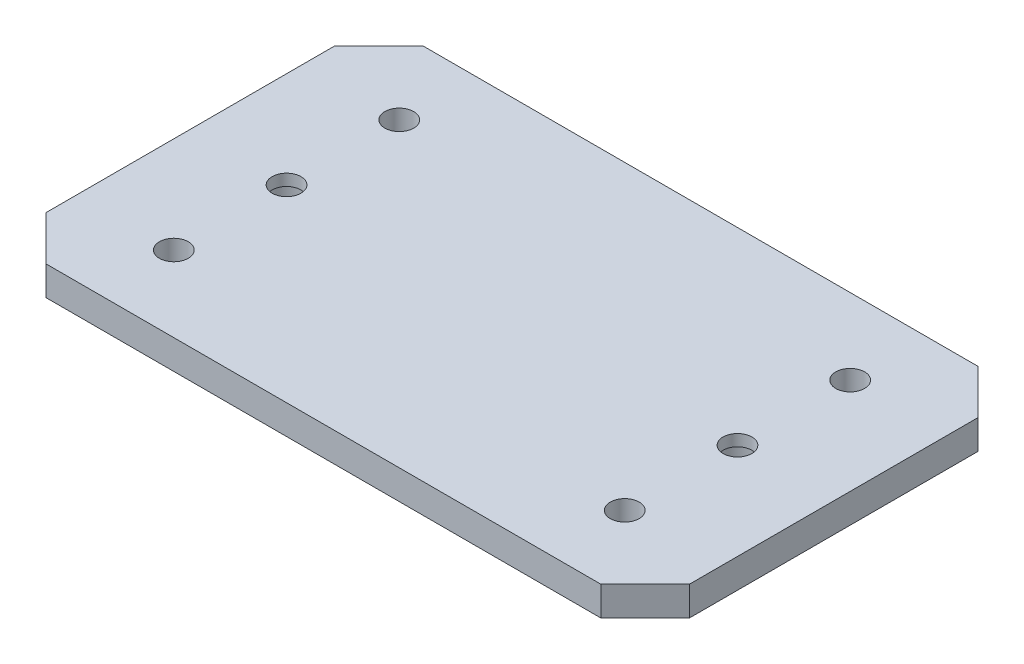
ISO-10303-21;
HEADER;
FILE_DESCRIPTION(('STEP AP214'),'2;1');
FILE_NAME('part.step','',(''),(''),'','','');
FILE_SCHEMA(('AUTOMOTIVE_DESIGN { 1 0 10303 214 1 1 1 1 }'));
ENDSEC;
DATA;
#1=APPLICATION_CONTEXT('core data for automotive mechanical design processes');
#2=APPLICATION_PROTOCOL_DEFINITION('international standard','automotive_design',2000,#1);
#3=PRODUCT_CONTEXT('',#1,'mechanical');
#4=PRODUCT('Part','Part','',(#3));
#5=PRODUCT_RELATED_PRODUCT_CATEGORY('part','',(#4));
#6=PRODUCT_DEFINITION_FORMATION('','',#4);
#7=PRODUCT_DEFINITION_CONTEXT('part definition',#1,'design');
#8=PRODUCT_DEFINITION('design','',#6,#7);
#9=PRODUCT_DEFINITION_SHAPE('','',#8);
#10=(LENGTH_UNIT() NAMED_UNIT(*) SI_UNIT(.MILLI.,.METRE.));
#11=(NAMED_UNIT(*) PLANE_ANGLE_UNIT() SI_UNIT($,.RADIAN.));
#12=(NAMED_UNIT(*) SI_UNIT($,.STERADIAN.) SOLID_ANGLE_UNIT());
#13=UNCERTAINTY_MEASURE_WITH_UNIT(LENGTH_MEASURE(1.E-05),#10,'distance_accuracy_value','');
#14=(GEOMETRIC_REPRESENTATION_CONTEXT(3) GLOBAL_UNCERTAINTY_ASSIGNED_CONTEXT((#13)) GLOBAL_UNIT_ASSIGNED_CONTEXT((#10,
#11,#12)) REPRESENTATION_CONTEXT('',''));
#15=CARTESIAN_POINT('',(0.,0.,0.));
#16=DIRECTION('',(0.,0.,1.));
#17=DIRECTION('',(1.,0.,0.));
#18=AXIS2_PLACEMENT_3D('',#15,#16,#17);
#19=CARTESIAN_POINT('',(-50.8,0.,0.));
#20=DIRECTION('',(0.,1.,0.));
#21=DIRECTION('',(0.,0.,1.));
#22=AXIS2_PLACEMENT_3D('',#19,#20,#21);
#23=CYLINDRICAL_SURFACE('',#22,3.25);
#24=CARTESIAN_POINT('',(-50.8,6.6,0.));
#25=DIRECTION('',(0.,1.,0.));
#26=DIRECTION('',(0.,0.,-1.));
#27=AXIS2_PLACEMENT_3D('',#24,#25,#26);
#28=CIRCLE('',#27,3.25);
#29=CARTESIAN_POINT('',(-50.8,6.6,-3.24999999999997));
#30=VERTEX_POINT('',#29);
#31=EDGE_CURVE('E189',#30,#30,#28,.T.);
#32=ORIENTED_EDGE('',*,*,#31,.T.);
#33=EDGE_LOOP('',(#32));
#34=FACE_BOUND('',#33,.T.);
#35=CARTESIAN_POINT('',(-50.8,4.,0.));
#36=DIRECTION('',(0.,-1.,0.));
#37=DIRECTION('',(0.,0.,-1.));
#38=AXIS2_PLACEMENT_3D('',#35,#36,#37);
#39=CIRCLE('',#38,3.25);
#40=CARTESIAN_POINT('',(-50.8,4.,-3.24999999999997));
#41=VERTEX_POINT('',#40);
#42=EDGE_CURVE('E212',#41,#41,#39,.F.);
#43=ORIENTED_EDGE('',*,*,#42,.F.);
#44=EDGE_LOOP('',(#43));
#45=FACE_BOUND('',#44,.T.);
#46=ADVANCED_FACE('F36',(#34,#45),#23,.F.);
#47=CARTESIAN_POINT('',(50.8,0.,0.));
#48=DIRECTION('',(0.,1.,0.));
#49=DIRECTION('',(0.,0.,1.));
#50=AXIS2_PLACEMENT_3D('',#47,#48,#49);
#51=CYLINDRICAL_SURFACE('',#50,3.25);
#52=CARTESIAN_POINT('',(50.8,6.6,0.));
#53=DIRECTION('',(0.,1.,0.));
#54=DIRECTION('',(0.,0.,1.));
#55=AXIS2_PLACEMENT_3D('',#52,#53,#54);
#56=CIRCLE('',#55,3.25);
#57=CARTESIAN_POINT('',(50.8,6.6,3.25));
#58=VERTEX_POINT('',#57);
#59=EDGE_CURVE('E182',#58,#58,#56,.T.);
#60=ORIENTED_EDGE('',*,*,#59,.T.);
#61=EDGE_LOOP('',(#60));
#62=FACE_BOUND('',#61,.T.);
#63=CARTESIAN_POINT('',(50.8,4.,0.));
#64=DIRECTION('',(0.,-1.,0.));
#65=DIRECTION('',(0.,0.,-1.));
#66=AXIS2_PLACEMENT_3D('',#63,#64,#65);
#67=CIRCLE('',#66,3.25);
#68=CARTESIAN_POINT('',(50.8,4.,-3.25));
#69=VERTEX_POINT('',#68);
#70=EDGE_CURVE('E222',#69,#69,#67,.F.);
#71=ORIENTED_EDGE('',*,*,#70,.F.);
#72=EDGE_LOOP('',(#71));
#73=FACE_BOUND('',#72,.T.);
#74=ADVANCED_FACE('F333',(#62,#73),#51,.F.);
#75=CARTESIAN_POINT('',(72.5,6.6,42.5));
#76=DIRECTION('',(-1.,0.,0.));
#77=DIRECTION('',(0.,0.,1.));
#78=AXIS2_PLACEMENT_3D('',#75,#76,#77);
#79=PLANE('',#78);
#80=DIRECTION('',(0.,0.,-1.));
#81=VECTOR('',#80,1.);
#82=CARTESIAN_POINT('',(72.5,0.,42.5));
#83=LINE('',#82,#81);
#84=CARTESIAN_POINT('',(72.5,0.,32.5));
#85=VERTEX_POINT('',#84);
#86=CARTESIAN_POINT('',(72.5,0.,-32.5));
#87=VERTEX_POINT('',#86);
#88=EDGE_CURVE('E129',#85,#87,#83,.T.);
#89=ORIENTED_EDGE('',*,*,#88,.T.);
#90=DIRECTION('',(0.,1.,0.));
#91=VECTOR('',#90,1.);
#92=CARTESIAN_POINT('',(72.5,6.6,-32.5));
#93=LINE('',#92,#91);
#94=CARTESIAN_POINT('',(72.5,6.6,-32.5));
#95=VERTEX_POINT('',#94);
#96=EDGE_CURVE('E107',#87,#95,#93,.T.);
#97=ORIENTED_EDGE('',*,*,#96,.T.);
#98=DIRECTION('',(0.,0.,-1.));
#99=VECTOR('',#98,1.);
#100=CARTESIAN_POINT('',(72.5,6.6,42.5));
#101=LINE('',#100,#99);
#102=CARTESIAN_POINT('',(72.5,6.6,32.5));
#103=VERTEX_POINT('',#102);
#104=EDGE_CURVE('E139',#103,#95,#101,.T.);
#105=ORIENTED_EDGE('',*,*,#104,.F.);
#106=DIRECTION('',(0.,-1.,0.));
#107=VECTOR('',#106,1.);
#108=CARTESIAN_POINT('',(72.5,6.6,32.5));
#109=LINE('',#108,#107);
#110=EDGE_CURVE('E112',#103,#85,#109,.T.);
#111=ORIENTED_EDGE('',*,*,#110,.T.);
#112=EDGE_LOOP('',(#89,#97,#105,#111));
#113=FACE_BOUND('',#112,.T.);
#114=ADVANCED_FACE('F321',(#113),#79,.F.);
#115=CARTESIAN_POINT('',(-72.5,6.6,-42.5));
#116=DIRECTION('',(0.,0.,1.));
#117=DIRECTION('',(1.,0.,0.));
#118=AXIS2_PLACEMENT_3D('',#115,#116,#117);
#119=PLANE('',#118);
#120=DIRECTION('',(-1.,0.,0.));
#121=VECTOR('',#120,1.);
#122=CARTESIAN_POINT('',(-72.5,6.6,-42.5));
#123=LINE('',#122,#121);
#124=CARTESIAN_POINT('',(62.5,6.6,-42.5));
#125=VERTEX_POINT('',#124);
#126=CARTESIAN_POINT('',(-62.5,6.6,-42.5));
#127=VERTEX_POINT('',#126);
#128=EDGE_CURVE('E122',#125,#127,#123,.T.);
#129=ORIENTED_EDGE('',*,*,#128,.F.);
#130=DIRECTION('',(0.,-1.,0.));
#131=VECTOR('',#130,1.);
#132=CARTESIAN_POINT('',(62.5,6.6,-42.5));
#133=LINE('',#132,#131);
#134=CARTESIAN_POINT('',(62.5,0.,-42.5));
#135=VERTEX_POINT('',#134);
#136=EDGE_CURVE('E106',#125,#135,#133,.T.);
#137=ORIENTED_EDGE('',*,*,#136,.T.);
#138=DIRECTION('',(-1.,0.,0.));
#139=VECTOR('',#138,1.);
#140=CARTESIAN_POINT('',(-72.5,0.,-42.5));
#141=LINE('',#140,#139);
#142=CARTESIAN_POINT('',(-62.5,0.,-42.5));
#143=VERTEX_POINT('',#142);
#144=EDGE_CURVE('E119',#135,#143,#141,.T.);
#145=ORIENTED_EDGE('',*,*,#144,.T.);
#146=DIRECTION('',(0.,1.,0.));
#147=VECTOR('',#146,1.);
#148=CARTESIAN_POINT('',(-62.5,6.6,-42.5));
#149=LINE('',#148,#147);
#150=EDGE_CURVE('E124',#143,#127,#149,.T.);
#151=ORIENTED_EDGE('',*,*,#150,.T.);
#152=EDGE_LOOP('',(#129,#137,#145,#151));
#153=FACE_BOUND('',#152,.T.);
#154=ADVANCED_FACE('F118',(#153),#119,.F.);
#155=CARTESIAN_POINT('',(-72.5,6.6,42.5));
#156=DIRECTION('',(1.,0.,0.));
#157=DIRECTION('',(0.,0.,-1.));
#158=AXIS2_PLACEMENT_3D('',#155,#156,#157);
#159=PLANE('',#158);
#160=DIRECTION('',(0.,0.,1.));
#161=VECTOR('',#160,1.);
#162=CARTESIAN_POINT('',(-72.5,0.,42.5));
#163=LINE('',#162,#161);
#164=CARTESIAN_POINT('',(-72.5,0.,-32.5));
#165=VERTEX_POINT('',#164);
#166=CARTESIAN_POINT('',(-72.5,0.,32.5));
#167=VERTEX_POINT('',#166);
#168=EDGE_CURVE('E128',#165,#167,#163,.T.);
#169=ORIENTED_EDGE('',*,*,#168,.T.);
#170=DIRECTION('',(0.,1.,0.));
#171=VECTOR('',#170,1.);
#172=CARTESIAN_POINT('',(-72.5,6.6,32.5));
#173=LINE('',#172,#171);
#174=CARTESIAN_POINT('',(-72.5,6.6,32.5));
#175=VERTEX_POINT('',#174);
#176=EDGE_CURVE('E11',#167,#175,#173,.T.);
#177=ORIENTED_EDGE('',*,*,#176,.T.);
#178=DIRECTION('',(0.,0.,1.));
#179=VECTOR('',#178,1.);
#180=CARTESIAN_POINT('',(-72.5,6.6,42.5));
#181=LINE('',#180,#179);
#182=CARTESIAN_POINT('',(-72.5,6.6,-32.5));
#183=VERTEX_POINT('',#182);
#184=EDGE_CURVE('E165',#183,#175,#181,.T.);
#185=ORIENTED_EDGE('',*,*,#184,.F.);
#186=DIRECTION('',(0.,-1.,0.));
#187=VECTOR('',#186,1.);
#188=CARTESIAN_POINT('',(-72.5,6.6,-32.5));
#189=LINE('',#188,#187);
#190=EDGE_CURVE('E44',#183,#165,#189,.T.);
#191=ORIENTED_EDGE('',*,*,#190,.T.);
#192=EDGE_LOOP('',(#169,#177,#185,#191));
#193=FACE_BOUND('',#192,.T.);
#194=ADVANCED_FACE('F163',(#193),#159,.F.);
#195=CARTESIAN_POINT('',(-72.5,6.6,42.5));
#196=DIRECTION('',(0.,0.,-1.));
#197=DIRECTION('',(-1.,0.,0.));
#198=AXIS2_PLACEMENT_3D('',#195,#196,#197);
#199=PLANE('',#198);
#200=DIRECTION('',(1.,0.,0.));
#201=VECTOR('',#200,1.);
#202=CARTESIAN_POINT('',(-72.5,0.,42.5));
#203=LINE('',#202,#201);
#204=CARTESIAN_POINT('',(-62.5,0.,42.5));
#205=VERTEX_POINT('',#204);
#206=CARTESIAN_POINT('',(62.5,0.,42.5));
#207=VERTEX_POINT('',#206);
#208=EDGE_CURVE('E132',#205,#207,#203,.T.);
#209=ORIENTED_EDGE('',*,*,#208,.T.);
#210=DIRECTION('',(0.,1.,0.));
#211=VECTOR('',#210,1.);
#212=CARTESIAN_POINT('',(62.5,6.6,42.5));
#213=LINE('',#212,#211);
#214=CARTESIAN_POINT('',(62.5,6.6,42.5));
#215=VERTEX_POINT('',#214);
#216=EDGE_CURVE('E51',#207,#215,#213,.T.);
#217=ORIENTED_EDGE('',*,*,#216,.T.);
#218=DIRECTION('',(1.,0.,0.));
#219=VECTOR('',#218,1.);
#220=CARTESIAN_POINT('',(-72.5,6.6,42.5));
#221=LINE('',#220,#219);
#222=CARTESIAN_POINT('',(-62.5,6.6,42.5));
#223=VERTEX_POINT('',#222);
#224=EDGE_CURVE('E140',#223,#215,#221,.T.);
#225=ORIENTED_EDGE('',*,*,#224,.F.);
#226=DIRECTION('',(0.,-1.,0.));
#227=VECTOR('',#226,1.);
#228=CARTESIAN_POINT('',(-62.5,6.6,42.5));
#229=LINE('',#228,#227);
#230=EDGE_CURVE('E156',#223,#205,#229,.T.);
#231=ORIENTED_EDGE('',*,*,#230,.T.);
#232=EDGE_LOOP('',(#209,#217,#225,#231));
#233=FACE_BOUND('',#232,.T.);
#234=ADVANCED_FACE('F172',(#233),#199,.F.);
#235=CARTESIAN_POINT('',(0.,6.6,0.));
#236=DIRECTION('',(0.,-1.,0.));
#237=DIRECTION('',(0.,0.,-1.));
#238=AXIS2_PLACEMENT_3D('',#235,#236,#237);
#239=PLANE('',#238);
#240=ORIENTED_EDGE('',*,*,#59,.F.);
#241=EDGE_LOOP('',(#240));
#242=FACE_BOUND('',#241,.T.);
#243=CARTESIAN_POINT('',(50.8,6.6,-25.4));
#244=DIRECTION('',(0.,1.,0.));
#245=DIRECTION('',(0.,0.,1.));
#246=AXIS2_PLACEMENT_3D('',#243,#244,#245);
#247=CIRCLE('',#246,3.25);
#248=CARTESIAN_POINT('',(50.8,6.6,-22.15));
#249=VERTEX_POINT('',#248);
#250=EDGE_CURVE('E198',#249,#249,#247,.T.);
#251=ORIENTED_EDGE('',*,*,#250,.F.);
#252=EDGE_LOOP('',(#251));
#253=FACE_BOUND('',#252,.T.);
#254=CARTESIAN_POINT('',(50.8000000000005,6.6,25.4));
#255=DIRECTION('',(0.,1.,0.));
#256=DIRECTION('',(0.,0.,1.));
#257=AXIS2_PLACEMENT_3D('',#254,#255,#256);
#258=CIRCLE('',#257,3.25);
#259=CARTESIAN_POINT('',(50.8000000000005,6.6,28.65));
#260=VERTEX_POINT('',#259);
#261=EDGE_CURVE('E192',#260,#260,#258,.T.);
#262=ORIENTED_EDGE('',*,*,#261,.F.);
#263=EDGE_LOOP('',(#262));
#264=FACE_BOUND('',#263,.T.);
#265=CARTESIAN_POINT('',(-50.7999999999995,6.6,25.4));
#266=DIRECTION('',(0.,1.,0.));
#267=DIRECTION('',(0.,0.,1.));
#268=AXIS2_PLACEMENT_3D('',#265,#266,#267);
#269=CIRCLE('',#268,3.25);
#270=CARTESIAN_POINT('',(-50.7999999999995,6.6,28.65));
#271=VERTEX_POINT('',#270);
#272=EDGE_CURVE('E185',#271,#271,#269,.T.);
#273=ORIENTED_EDGE('',*,*,#272,.F.);
#274=EDGE_LOOP('',(#273));
#275=FACE_BOUND('',#274,.T.);
#276=ORIENTED_EDGE('',*,*,#31,.F.);
#277=EDGE_LOOP('',(#276));
#278=FACE_BOUND('',#277,.T.);
#279=CARTESIAN_POINT('',(-50.8,6.6,-25.4));
#280=DIRECTION('',(0.,1.,0.));
#281=DIRECTION('',(0.,0.,1.));
#282=AXIS2_PLACEMENT_3D('',#279,#280,#281);
#283=CIRCLE('',#282,3.25);
#284=CARTESIAN_POINT('',(-50.8,6.6,-22.15));
#285=VERTEX_POINT('',#284);
#286=EDGE_CURVE('E179',#285,#285,#283,.T.);
#287=ORIENTED_EDGE('',*,*,#286,.F.);
#288=EDGE_LOOP('',(#287));
#289=FACE_BOUND('',#288,.T.);
#290=ORIENTED_EDGE('',*,*,#104,.T.);
#291=DIRECTION('',(0.707106781186546,0.,0.70710678118655));
#292=VECTOR('',#291,1.);
#293=CARTESIAN_POINT('',(62.5,6.6,-42.5));
#294=LINE('',#293,#292);
#295=EDGE_CURVE('E154',#95,#125,#294,.F.);
#296=ORIENTED_EDGE('',*,*,#295,.T.);
#297=ORIENTED_EDGE('',*,*,#128,.T.);
#298=DIRECTION('',(0.707106781186549,0.,-0.707106781186546));
#299=VECTOR('',#298,1.);
#300=CARTESIAN_POINT('',(-72.5,6.6,-32.5));
#301=LINE('',#300,#299);
#302=EDGE_CURVE('E149',#127,#183,#301,.F.);
#303=ORIENTED_EDGE('',*,*,#302,.T.);
#304=ORIENTED_EDGE('',*,*,#184,.T.);
#305=DIRECTION('',(-0.707106781186546,0.,-0.707106781186549));
#306=VECTOR('',#305,1.);
#307=CARTESIAN_POINT('',(-62.5,6.6,42.5));
#308=LINE('',#307,#306);
#309=EDGE_CURVE('E58',#175,#223,#308,.F.);
#310=ORIENTED_EDGE('',*,*,#309,.T.);
#311=ORIENTED_EDGE('',*,*,#224,.T.);
#312=DIRECTION('',(-0.707106781186549,0.,0.707106781186547));
#313=VECTOR('',#312,1.);
#314=CARTESIAN_POINT('',(72.5,6.6,32.5));
#315=LINE('',#314,#313);
#316=EDGE_CURVE('E152',#215,#103,#315,.F.);
#317=ORIENTED_EDGE('',*,*,#316,.T.);
#318=EDGE_LOOP('',(#290,#296,#297,#303,#304,#310,#311,#317));
#319=FACE_BOUND('',#318,.T.);
#320=ADVANCED_FACE('F286',(#242,#253,#264,#275,#278,#289,#319),#239,.F.);
#321=CARTESIAN_POINT('',(0.,0.,0.));
#322=DIRECTION('',(0.,-1.,0.));
#323=DIRECTION('',(0.,0.,-1.));
#324=AXIS2_PLACEMENT_3D('',#321,#322,#323);
#325=PLANE('',#324);
#326=CARTESIAN_POINT('',(-25.3999999999992,0.,0.));
#327=DIRECTION('',(0.,-1.,0.));
#328=DIRECTION('',(0.,0.,-1.));
#329=AXIS2_PLACEMENT_3D('',#326,#327,#328);
#330=CIRCLE('',#329,2.25);
#331=CARTESIAN_POINT('',(-25.3999999999992,0.,-2.24999999999999));
#332=VERTEX_POINT('',#331);
#333=EDGE_CURVE('E230',#332,#332,#330,.T.);
#334=ORIENTED_EDGE('',*,*,#333,.F.);
#335=EDGE_LOOP('',(#334));
#336=FACE_BOUND('',#335,.T.);
#337=CARTESIAN_POINT('',(-25.3999999999989,0.,-25.4));
#338=DIRECTION('',(0.,-1.,0.));
#339=DIRECTION('',(0.,0.,-1.));
#340=AXIS2_PLACEMENT_3D('',#337,#338,#339);
#341=CIRCLE('',#340,2.25);
#342=CARTESIAN_POINT('',(-25.3999999999989,0.,-27.65));
#343=VERTEX_POINT('',#342);
#344=EDGE_CURVE('E249',#343,#343,#341,.T.);
#345=ORIENTED_EDGE('',*,*,#344,.F.);
#346=EDGE_LOOP('',(#345));
#347=FACE_BOUND('',#346,.T.);
#348=CARTESIAN_POINT('',(1.06858966120171E-12,0.,-25.4));
#349=DIRECTION('',(0.,-1.,0.));
#350=DIRECTION('',(0.,0.,-1.));
#351=AXIS2_PLACEMENT_3D('',#348,#349,#350);
#352=CIRCLE('',#351,2.25);
#353=CARTESIAN_POINT('',(1.06858966120171E-12,0.,-27.65));
#354=VERTEX_POINT('',#353);
#355=EDGE_CURVE('E243',#354,#354,#352,.T.);
#356=ORIENTED_EDGE('',*,*,#355,.F.);
#357=EDGE_LOOP('',(#356));
#358=FACE_BOUND('',#357,.T.);
#359=CARTESIAN_POINT('',(7.97972798949331E-13,0.,0.));
#360=DIRECTION('',(0.,-1.,0.));
#361=DIRECTION('',(0.,0.,-1.));
#362=AXIS2_PLACEMENT_3D('',#359,#360,#361);
#363=CIRCLE('',#362,2.25);
#364=CARTESIAN_POINT('',(7.97972798949331E-13,0.,-2.24999999999999));
#365=VERTEX_POINT('',#364);
#366=EDGE_CURVE('E236',#365,#365,#363,.T.);
#367=ORIENTED_EDGE('',*,*,#366,.F.);
#368=EDGE_LOOP('',(#367));
#369=FACE_BOUND('',#368,.T.);
#370=CARTESIAN_POINT('',(5.34294830600857E-13,0.,25.4));
#371=DIRECTION('',(0.,-1.,0.));
#372=DIRECTION('',(0.,0.,-1.));
#373=AXIS2_PLACEMENT_3D('',#370,#371,#372);
#374=CIRCLE('',#373,2.25);
#375=CARTESIAN_POINT('',(5.34294830600857E-13,0.,23.15));
#376=VERTEX_POINT('',#375);
#377=EDGE_CURVE('E237',#376,#376,#374,.T.);
#378=ORIENTED_EDGE('',*,*,#377,.F.);
#379=EDGE_LOOP('',(#378));
#380=FACE_BOUND('',#379,.T.);
#381=CARTESIAN_POINT('',(25.4000000000005,0.,25.4));
#382=DIRECTION('',(0.,-1.,0.));
#383=DIRECTION('',(0.,0.,-1.));
#384=AXIS2_PLACEMENT_3D('',#381,#382,#383);
#385=CIRCLE('',#384,2.25);
#386=CARTESIAN_POINT('',(25.4000000000005,0.,23.15));
#387=VERTEX_POINT('',#386);
#388=EDGE_CURVE('E272',#387,#387,#385,.T.);
#389=ORIENTED_EDGE('',*,*,#388,.F.);
#390=EDGE_LOOP('',(#389));
#391=FACE_BOUND('',#390,.T.);
#392=CARTESIAN_POINT('',(25.4000000000008,0.,0.));
#393=DIRECTION('',(0.,-1.,0.));
#394=DIRECTION('',(0.,0.,-1.));
#395=AXIS2_PLACEMENT_3D('',#392,#393,#394);
#396=CIRCLE('',#395,2.25);
#397=CARTESIAN_POINT('',(25.4000000000008,0.,-2.24999999999999));
#398=VERTEX_POINT('',#397);
#399=EDGE_CURVE('E266',#398,#398,#396,.T.);
#400=ORIENTED_EDGE('',*,*,#399,.F.);
#401=EDGE_LOOP('',(#400));
#402=FACE_BOUND('',#401,.T.);
#403=CARTESIAN_POINT('',(25.4000000000011,0.,-25.4));
#404=DIRECTION('',(0.,-1.,0.));
#405=DIRECTION('',(0.,0.,-1.));
#406=AXIS2_PLACEMENT_3D('',#403,#404,#405);
#407=CIRCLE('',#406,2.25);
#408=CARTESIAN_POINT('',(25.4000000000011,0.,-27.65));
#409=VERTEX_POINT('',#408);
#410=EDGE_CURVE('E260',#409,#409,#407,.T.);
#411=ORIENTED_EDGE('',*,*,#410,.F.);
#412=EDGE_LOOP('',(#411));
#413=FACE_BOUND('',#412,.T.);
#414=CARTESIAN_POINT('',(-25.3999999999995,0.,25.4));
#415=DIRECTION('',(0.,-1.,0.));
#416=DIRECTION('',(0.,0.,-1.));
#417=AXIS2_PLACEMENT_3D('',#414,#415,#416);
#418=CIRCLE('',#417,2.25);
#419=CARTESIAN_POINT('',(-25.3999999999995,0.,23.15));
#420=VERTEX_POINT('',#419);
#421=EDGE_CURVE('E227',#420,#420,#418,.T.);
#422=ORIENTED_EDGE('',*,*,#421,.F.);
#423=EDGE_LOOP('',(#422));
#424=FACE_BOUND('',#423,.T.);
#425=CARTESIAN_POINT('',(50.8,0.,0.));
#426=DIRECTION('',(0.,-1.,0.));
#427=DIRECTION('',(0.,0.,-1.));
#428=AXIS2_PLACEMENT_3D('',#425,#426,#427);
#429=CIRCLE('',#428,5.25);
#430=CARTESIAN_POINT('',(50.8,0.,-5.24999999999999));
#431=VERTEX_POINT('',#430);
#432=EDGE_CURVE('E217',#431,#431,#429,.T.);
#433=ORIENTED_EDGE('',*,*,#432,.F.);
#434=EDGE_LOOP('',(#433));
#435=FACE_BOUND('',#434,.T.);
#436=CARTESIAN_POINT('',(-50.8,0.,0.));
#437=DIRECTION('',(0.,-1.,0.));
#438=DIRECTION('',(0.,0.,-1.));
#439=AXIS2_PLACEMENT_3D('',#436,#437,#438);
#440=CIRCLE('',#439,5.25);
#441=CARTESIAN_POINT('',(-50.8,0.,-5.24999999999997));
#442=VERTEX_POINT('',#441);
#443=EDGE_CURVE('E209',#442,#442,#440,.T.);
#444=ORIENTED_EDGE('',*,*,#443,.F.);
#445=EDGE_LOOP('',(#444));
#446=FACE_BOUND('',#445,.T.);
#447=CARTESIAN_POINT('',(50.8,0.,-25.4));
#448=DIRECTION('',(0.,1.,0.));
#449=DIRECTION('',(0.,0.,1.));
#450=AXIS2_PLACEMENT_3D('',#447,#448,#449);
#451=CIRCLE('',#450,3.25);
#452=CARTESIAN_POINT('',(50.8,0.,-22.15));
#453=VERTEX_POINT('',#452);
#454=EDGE_CURVE('E201',#453,#453,#451,.T.);
#455=ORIENTED_EDGE('',*,*,#454,.T.);
#456=EDGE_LOOP('',(#455));
#457=FACE_BOUND('',#456,.T.);
#458=CARTESIAN_POINT('',(50.8000000000005,0.,25.4));
#459=DIRECTION('',(0.,1.,0.));
#460=DIRECTION('',(0.,0.,1.));
#461=AXIS2_PLACEMENT_3D('',#458,#459,#460);
#462=CIRCLE('',#461,3.25);
#463=CARTESIAN_POINT('',(50.8000000000005,0.,28.65));
#464=VERTEX_POINT('',#463);
#465=EDGE_CURVE('E195',#464,#464,#462,.T.);
#466=ORIENTED_EDGE('',*,*,#465,.T.);
#467=EDGE_LOOP('',(#466));
#468=FACE_BOUND('',#467,.T.);
#469=CARTESIAN_POINT('',(-50.7999999999995,0.,25.4));
#470=DIRECTION('',(0.,1.,0.));
#471=DIRECTION('',(0.,0.,1.));
#472=AXIS2_PLACEMENT_3D('',#469,#470,#471);
#473=CIRCLE('',#472,3.25);
#474=CARTESIAN_POINT('',(-50.7999999999995,0.,28.65));
#475=VERTEX_POINT('',#474);
#476=EDGE_CURVE('E188',#475,#475,#473,.T.);
#477=ORIENTED_EDGE('',*,*,#476,.T.);
#478=EDGE_LOOP('',(#477));
#479=FACE_BOUND('',#478,.T.);
#480=CARTESIAN_POINT('',(-50.8,0.,-25.4));
#481=DIRECTION('',(0.,1.,0.));
#482=DIRECTION('',(0.,0.,1.));
#483=AXIS2_PLACEMENT_3D('',#480,#481,#482);
#484=CIRCLE('',#483,3.25);
#485=CARTESIAN_POINT('',(-50.8,0.,-22.15));
#486=VERTEX_POINT('',#485);
#487=EDGE_CURVE('E134',#486,#486,#484,.T.);
#488=ORIENTED_EDGE('',*,*,#487,.T.);
#489=EDGE_LOOP('',(#488));
#490=FACE_BOUND('',#489,.T.);
#491=ORIENTED_EDGE('',*,*,#144,.F.);
#492=DIRECTION('',(-0.707106781186546,0.,-0.70710678118655));
#493=VECTOR('',#492,1.);
#494=CARTESIAN_POINT('',(52.5000000000002,0.,-52.4999999999999));
#495=LINE('',#494,#493);
#496=EDGE_CURVE('E102',#135,#87,#495,.F.);
#497=ORIENTED_EDGE('',*,*,#496,.T.);
#498=ORIENTED_EDGE('',*,*,#88,.F.);
#499=DIRECTION('',(0.707106781186549,0.,-0.707106781186547));
#500=VECTOR('',#499,1.);
#501=CARTESIAN_POINT('',(52.4999999999999,0.,52.5));
#502=LINE('',#501,#500);
#503=EDGE_CURVE('E113',#85,#207,#502,.F.);
#504=ORIENTED_EDGE('',*,*,#503,.T.);
#505=ORIENTED_EDGE('',*,*,#208,.F.);
#506=DIRECTION('',(0.707106781186546,0.,0.707106781186549));
#507=VECTOR('',#506,1.);
#508=CARTESIAN_POINT('',(-52.5000000000001,0.,52.4999999999999));
#509=LINE('',#508,#507);
#510=EDGE_CURVE('E143',#205,#167,#509,.F.);
#511=ORIENTED_EDGE('',*,*,#510,.T.);
#512=ORIENTED_EDGE('',*,*,#168,.F.);
#513=DIRECTION('',(-0.707106781186549,0.,0.707106781186546));
#514=VECTOR('',#513,1.);
#515=CARTESIAN_POINT('',(-52.4999999999999,0.,-52.5));
#516=LINE('',#515,#514);
#517=EDGE_CURVE('E123',#165,#143,#516,.F.);
#518=ORIENTED_EDGE('',*,*,#517,.T.);
#519=EDGE_LOOP('',(#491,#497,#498,#504,#505,#511,#512,#518));
#520=FACE_BOUND('',#519,.T.);
#521=ADVANCED_FACE('F126',(#336,#347,#358,#369,#380,#391,#402,#413,#424,#435,#446,#457,#468,
#479,#490,#520),#325,.T.);
#522=CARTESIAN_POINT('',(-50.8,0.,-25.4));
#523=DIRECTION('',(0.,1.,0.));
#524=DIRECTION('',(0.,0.,1.));
#525=AXIS2_PLACEMENT_3D('',#522,#523,#524);
#526=CYLINDRICAL_SURFACE('',#525,3.25);
#527=ORIENTED_EDGE('',*,*,#487,.F.);
#528=EDGE_LOOP('',(#527));
#529=FACE_BOUND('',#528,.T.);
#530=ORIENTED_EDGE('',*,*,#286,.T.);
#531=EDGE_LOOP('',(#530));
#532=FACE_BOUND('',#531,.T.);
#533=ADVANCED_FACE('F285',(#529,#532),#526,.F.);
#534=CARTESIAN_POINT('',(-50.7999999999995,0.,25.4));
#535=DIRECTION('',(0.,1.,0.));
#536=DIRECTION('',(0.,0.,1.));
#537=AXIS2_PLACEMENT_3D('',#534,#535,#536);
#538=CYLINDRICAL_SURFACE('',#537,3.25);
#539=ORIENTED_EDGE('',*,*,#476,.F.);
#540=EDGE_LOOP('',(#539));
#541=FACE_BOUND('',#540,.T.);
#542=ORIENTED_EDGE('',*,*,#272,.T.);
#543=EDGE_LOOP('',(#542));
#544=FACE_BOUND('',#543,.T.);
#545=ADVANCED_FACE('F311',(#541,#544),#538,.F.);
#546=CARTESIAN_POINT('',(50.8000000000005,0.,25.4));
#547=DIRECTION('',(0.,1.,0.));
#548=DIRECTION('',(0.,0.,1.));
#549=AXIS2_PLACEMENT_3D('',#546,#547,#548);
#550=CYLINDRICAL_SURFACE('',#549,3.25);
#551=ORIENTED_EDGE('',*,*,#465,.F.);
#552=EDGE_LOOP('',(#551));
#553=FACE_BOUND('',#552,.T.);
#554=ORIENTED_EDGE('',*,*,#261,.T.);
#555=EDGE_LOOP('',(#554));
#556=FACE_BOUND('',#555,.T.);
#557=ADVANCED_FACE('F348',(#553,#556),#550,.F.);
#558=CARTESIAN_POINT('',(50.8,0.,-25.4));
#559=DIRECTION('',(0.,1.,0.));
#560=DIRECTION('',(0.,0.,1.));
#561=AXIS2_PLACEMENT_3D('',#558,#559,#560);
#562=CYLINDRICAL_SURFACE('',#561,3.25);
#563=ORIENTED_EDGE('',*,*,#454,.F.);
#564=EDGE_LOOP('',(#563));
#565=FACE_BOUND('',#564,.T.);
#566=ORIENTED_EDGE('',*,*,#250,.T.);
#567=EDGE_LOOP('',(#566));
#568=FACE_BOUND('',#567,.T.);
#569=ADVANCED_FACE('F330',(#565,#568),#562,.F.);
#570=CARTESIAN_POINT('',(62.5,6.6,-42.5));
#571=DIRECTION('',(-0.707106781186549,0.,0.707106781186545));
#572=DIRECTION('',(0.,-1.,0.));
#573=AXIS2_PLACEMENT_3D('',#570,#571,#572);
#574=PLANE('',#573);
#575=ORIENTED_EDGE('',*,*,#295,.F.);
#576=ORIENTED_EDGE('',*,*,#96,.F.);
#577=ORIENTED_EDGE('',*,*,#496,.F.);
#578=ORIENTED_EDGE('',*,*,#136,.F.);
#579=EDGE_LOOP('',(#575,#576,#577,#578));
#580=FACE_BOUND('',#579,.T.);
#581=ADVANCED_FACE('F105',(#580),#574,.F.);
#582=CARTESIAN_POINT('',(72.5,6.6,32.5));
#583=DIRECTION('',(-0.707106781186547,0.,-0.707106781186549));
#584=DIRECTION('',(0.,-1.,0.));
#585=AXIS2_PLACEMENT_3D('',#582,#583,#584);
#586=PLANE('',#585);
#587=ORIENTED_EDGE('',*,*,#316,.F.);
#588=ORIENTED_EDGE('',*,*,#216,.F.);
#589=ORIENTED_EDGE('',*,*,#503,.F.);
#590=ORIENTED_EDGE('',*,*,#110,.F.);
#591=EDGE_LOOP('',(#587,#588,#589,#590));
#592=FACE_BOUND('',#591,.T.);
#593=ADVANCED_FACE('F323',(#592),#586,.F.);
#594=CARTESIAN_POINT('',(-62.5,6.6,42.5));
#595=DIRECTION('',(0.707106781186549,0.,-0.707106781186546));
#596=DIRECTION('',(0.,-1.,0.));
#597=AXIS2_PLACEMENT_3D('',#594,#595,#596);
#598=PLANE('',#597);
#599=ORIENTED_EDGE('',*,*,#309,.F.);
#600=ORIENTED_EDGE('',*,*,#176,.F.);
#601=ORIENTED_EDGE('',*,*,#510,.F.);
#602=ORIENTED_EDGE('',*,*,#230,.F.);
#603=EDGE_LOOP('',(#599,#600,#601,#602));
#604=FACE_BOUND('',#603,.T.);
#605=ADVANCED_FACE('F171',(#604),#598,.F.);
#606=CARTESIAN_POINT('',(-72.5,6.6,-32.5));
#607=DIRECTION('',(0.707106781186546,0.,0.707106781186549));
#608=DIRECTION('',(0.,-1.,0.));
#609=AXIS2_PLACEMENT_3D('',#606,#607,#608);
#610=PLANE('',#609);
#611=ORIENTED_EDGE('',*,*,#302,.F.);
#612=ORIENTED_EDGE('',*,*,#150,.F.);
#613=ORIENTED_EDGE('',*,*,#517,.F.);
#614=ORIENTED_EDGE('',*,*,#190,.F.);
#615=EDGE_LOOP('',(#611,#612,#613,#614));
#616=FACE_BOUND('',#615,.T.);
#617=ADVANCED_FACE('F38',(#616),#610,.F.);
#618=CARTESIAN_POINT('',(50.8,4.,0.));
#619=DIRECTION('',(0.,-1.,0.));
#620=DIRECTION('',(0.,0.,-1.));
#621=AXIS2_PLACEMENT_3D('',#618,#619,#620);
#622=CYLINDRICAL_SURFACE('',#621,5.25);
#623=CARTESIAN_POINT('',(50.8,4.,0.));
#624=DIRECTION('',(0.,-1.,0.));
#625=DIRECTION('',(0.,0.,-1.));
#626=AXIS2_PLACEMENT_3D('',#623,#624,#625);
#627=CIRCLE('',#626,5.25);
#628=CARTESIAN_POINT('',(50.8,4.,-5.24999999999999));
#629=VERTEX_POINT('',#628);
#630=EDGE_CURVE('E208',#629,#629,#627,.T.);
#631=ORIENTED_EDGE('',*,*,#630,.F.);
#632=EDGE_LOOP('',(#631));
#633=FACE_BOUND('',#632,.T.);
#634=ORIENTED_EDGE('',*,*,#432,.T.);
#635=EDGE_LOOP('',(#634));
#636=FACE_BOUND('',#635,.T.);
#637=ADVANCED_FACE('F427',(#633,#636),#622,.F.);
#638=CARTESIAN_POINT('',(0.,4.,0.));
#639=DIRECTION('',(0.,-1.,0.));
#640=DIRECTION('',(0.,0.,-1.));
#641=AXIS2_PLACEMENT_3D('',#638,#639,#640);
#642=PLANE('',#641);
#643=ORIENTED_EDGE('',*,*,#70,.T.);
#644=EDGE_LOOP('',(#643));
#645=FACE_BOUND('',#644,.T.);
#646=ORIENTED_EDGE('',*,*,#630,.T.);
#647=EDGE_LOOP('',(#646));
#648=FACE_BOUND('',#647,.T.);
#649=ADVANCED_FACE('F444',(#645,#648),#642,.T.);
#650=CARTESIAN_POINT('',(-50.8,4.,0.));
#651=DIRECTION('',(0.,-1.,0.));
#652=DIRECTION('',(0.,0.,-1.));
#653=AXIS2_PLACEMENT_3D('',#650,#651,#652);
#654=CYLINDRICAL_SURFACE('',#653,5.25);
#655=CARTESIAN_POINT('',(-50.8,4.,0.));
#656=DIRECTION('',(0.,-1.,0.));
#657=DIRECTION('',(0.,0.,-1.));
#658=AXIS2_PLACEMENT_3D('',#655,#656,#657);
#659=CIRCLE('',#658,5.25);
#660=CARTESIAN_POINT('',(-50.8,4.,-5.24999999999997));
#661=VERTEX_POINT('',#660);
#662=EDGE_CURVE('E214',#661,#661,#659,.T.);
#663=ORIENTED_EDGE('',*,*,#662,.F.);
#664=EDGE_LOOP('',(#663));
#665=FACE_BOUND('',#664,.T.);
#666=ORIENTED_EDGE('',*,*,#443,.T.);
#667=EDGE_LOOP('',(#666));
#668=FACE_BOUND('',#667,.T.);
#669=ADVANCED_FACE('F343',(#665,#668),#654,.F.);
#670=CARTESIAN_POINT('',(0.,4.,0.));
#671=DIRECTION('',(0.,-1.,0.));
#672=DIRECTION('',(0.,0.,-1.));
#673=AXIS2_PLACEMENT_3D('',#670,#671,#672);
#674=PLANE('',#673);
#675=ORIENTED_EDGE('',*,*,#42,.T.);
#676=EDGE_LOOP('',(#675));
#677=FACE_BOUND('',#676,.T.);
#678=ORIENTED_EDGE('',*,*,#662,.T.);
#679=EDGE_LOOP('',(#678));
#680=FACE_BOUND('',#679,.T.);
#681=ADVANCED_FACE('F462',(#677,#680),#674,.T.);
#682=CARTESIAN_POINT('',(-25.3999999999995,1.5,25.4));
#683=DIRECTION('',(0.,-1.,0.));
#684=DIRECTION('',(0.,0.,-1.));
#685=AXIS2_PLACEMENT_3D('',#682,#683,#684);
#686=CYLINDRICAL_SURFACE('',#685,2.25);
#687=CARTESIAN_POINT('',(-25.3999999999995,1.5,25.4));
#688=DIRECTION('',(0.,-1.,0.));
#689=DIRECTION('',(0.,0.,-1.));
#690=AXIS2_PLACEMENT_3D('',#687,#688,#689);
#691=CIRCLE('',#690,2.25);
#692=CARTESIAN_POINT('',(-25.3999999999995,1.5,23.15));
#693=VERTEX_POINT('',#692);
#694=EDGE_CURVE('E213',#693,#693,#691,.T.);
#695=ORIENTED_EDGE('',*,*,#694,.F.);
#696=EDGE_LOOP('',(#695));
#697=FACE_BOUND('',#696,.T.);
#698=ORIENTED_EDGE('',*,*,#421,.T.);
#699=EDGE_LOOP('',(#698));
#700=FACE_BOUND('',#699,.T.);
#701=ADVANCED_FACE('F470',(#697,#700),#686,.F.);
#702=CARTESIAN_POINT('',(-25.3999999999995,1.5,25.4));
#703=DIRECTION('',(0.,-1.,0.));
#704=DIRECTION('',(0.,0.,-1.));
#705=AXIS2_PLACEMENT_3D('',#702,#703,#704);
#706=PLANE('',#705);
#707=ORIENTED_EDGE('',*,*,#694,.T.);
#708=EDGE_LOOP('',(#707));
#709=FACE_BOUND('',#708,.T.);
#710=ADVANCED_FACE('F479',(#709),#706,.T.);
#711=CARTESIAN_POINT('',(25.4000000000011,1.5,-25.4));
#712=DIRECTION('',(0.,-1.,0.));
#713=DIRECTION('',(0.,0.,-1.));
#714=AXIS2_PLACEMENT_3D('',#711,#712,#713);
#715=CYLINDRICAL_SURFACE('',#714,2.25);
#716=CARTESIAN_POINT('',(25.4000000000011,1.5,-25.4));
#717=DIRECTION('',(0.,-1.,0.));
#718=DIRECTION('',(0.,0.,-1.));
#719=AXIS2_PLACEMENT_3D('',#716,#717,#718);
#720=CIRCLE('',#719,2.25);
#721=CARTESIAN_POINT('',(25.4000000000011,1.5,-27.65));
#722=VERTEX_POINT('',#721);
#723=EDGE_CURVE('E257',#722,#722,#720,.T.);
#724=ORIENTED_EDGE('',*,*,#723,.F.);
#725=EDGE_LOOP('',(#724));
#726=FACE_BOUND('',#725,.T.);
#727=ORIENTED_EDGE('',*,*,#410,.T.);
#728=EDGE_LOOP('',(#727));
#729=FACE_BOUND('',#728,.T.);
#730=ADVANCED_FACE('F486',(#726,#729),#715,.F.);
#731=CARTESIAN_POINT('',(25.4000000000011,1.5,-25.4));
#732=DIRECTION('',(0.,-1.,0.));
#733=DIRECTION('',(0.,0.,-1.));
#734=AXIS2_PLACEMENT_3D('',#731,#732,#733);
#735=PLANE('',#734);
#736=ORIENTED_EDGE('',*,*,#723,.T.);
#737=EDGE_LOOP('',(#736));
#738=FACE_BOUND('',#737,.T.);
#739=ADVANCED_FACE('F494',(#738),#735,.T.);
#740=CARTESIAN_POINT('',(25.4000000000008,1.5,0.));
#741=DIRECTION('',(0.,-1.,0.));
#742=DIRECTION('',(0.,0.,-1.));
#743=AXIS2_PLACEMENT_3D('',#740,#741,#742);
#744=CYLINDRICAL_SURFACE('',#743,2.25);
#745=CARTESIAN_POINT('',(25.4000000000008,1.5,0.));
#746=DIRECTION('',(0.,-1.,0.));
#747=DIRECTION('',(0.,0.,-1.));
#748=AXIS2_PLACEMENT_3D('',#745,#746,#747);
#749=CIRCLE('',#748,2.25);
#750=CARTESIAN_POINT('',(25.4000000000008,1.5,-2.24999999999999));
#751=VERTEX_POINT('',#750);
#752=EDGE_CURVE('E263',#751,#751,#749,.T.);
#753=ORIENTED_EDGE('',*,*,#752,.F.);
#754=EDGE_LOOP('',(#753));
#755=FACE_BOUND('',#754,.T.);
#756=ORIENTED_EDGE('',*,*,#399,.T.);
#757=EDGE_LOOP('',(#756));
#758=FACE_BOUND('',#757,.T.);
#759=ADVANCED_FACE('F502',(#755,#758),#744,.F.);
#760=CARTESIAN_POINT('',(25.4000000000008,1.5,0.));
#761=DIRECTION('',(0.,-1.,0.));
#762=DIRECTION('',(0.,0.,-1.));
#763=AXIS2_PLACEMENT_3D('',#760,#761,#762);
#764=PLANE('',#763);
#765=ORIENTED_EDGE('',*,*,#752,.T.);
#766=EDGE_LOOP('',(#765));
#767=FACE_BOUND('',#766,.T.);
#768=ADVANCED_FACE('F510',(#767),#764,.T.);
#769=CARTESIAN_POINT('',(25.4000000000005,1.5,25.4));
#770=DIRECTION('',(0.,-1.,0.));
#771=DIRECTION('',(0.,0.,-1.));
#772=AXIS2_PLACEMENT_3D('',#769,#770,#771);
#773=CYLINDRICAL_SURFACE('',#772,2.25);
#774=CARTESIAN_POINT('',(25.4000000000005,1.5,25.4));
#775=DIRECTION('',(0.,-1.,0.));
#776=DIRECTION('',(0.,0.,-1.));
#777=AXIS2_PLACEMENT_3D('',#774,#775,#776);
#778=CIRCLE('',#777,2.25);
#779=CARTESIAN_POINT('',(25.4000000000005,1.5,23.15));
#780=VERTEX_POINT('',#779);
#781=EDGE_CURVE('E269',#780,#780,#778,.T.);
#782=ORIENTED_EDGE('',*,*,#781,.F.);
#783=EDGE_LOOP('',(#782));
#784=FACE_BOUND('',#783,.T.);
#785=ORIENTED_EDGE('',*,*,#388,.T.);
#786=EDGE_LOOP('',(#785));
#787=FACE_BOUND('',#786,.T.);
#788=ADVANCED_FACE('F518',(#784,#787),#773,.F.);
#789=CARTESIAN_POINT('',(25.4000000000005,1.5,25.4));
#790=DIRECTION('',(0.,-1.,0.));
#791=DIRECTION('',(0.,0.,-1.));
#792=AXIS2_PLACEMENT_3D('',#789,#790,#791);
#793=PLANE('',#792);
#794=ORIENTED_EDGE('',*,*,#781,.T.);
#795=EDGE_LOOP('',(#794));
#796=FACE_BOUND('',#795,.T.);
#797=ADVANCED_FACE('F526',(#796),#793,.T.);
#798=CARTESIAN_POINT('',(5.34294830600857E-13,1.5,25.4));
#799=DIRECTION('',(0.,-1.,0.));
#800=DIRECTION('',(0.,0.,-1.));
#801=AXIS2_PLACEMENT_3D('',#798,#799,#800);
#802=CYLINDRICAL_SURFACE('',#801,2.25);
#803=CARTESIAN_POINT('',(5.34294830600857E-13,1.5,25.4));
#804=DIRECTION('',(0.,-1.,0.));
#805=DIRECTION('',(0.,0.,-1.));
#806=AXIS2_PLACEMENT_3D('',#803,#804,#805);
#807=CIRCLE('',#806,2.25);
#808=CARTESIAN_POINT('',(5.34294830600857E-13,1.5,23.15));
#809=VERTEX_POINT('',#808);
#810=EDGE_CURVE('E275',#809,#809,#807,.T.);
#811=ORIENTED_EDGE('',*,*,#810,.F.);
#812=EDGE_LOOP('',(#811));
#813=FACE_BOUND('',#812,.T.);
#814=ORIENTED_EDGE('',*,*,#377,.T.);
#815=EDGE_LOOP('',(#814));
#816=FACE_BOUND('',#815,.T.);
#817=ADVANCED_FACE('F281',(#813,#816),#802,.F.);
#818=CARTESIAN_POINT('',(5.34294830600857E-13,1.5,25.4));
#819=DIRECTION('',(0.,-1.,0.));
#820=DIRECTION('',(0.,0.,-1.));
#821=AXIS2_PLACEMENT_3D('',#818,#819,#820);
#822=PLANE('',#821);
#823=ORIENTED_EDGE('',*,*,#810,.T.);
#824=EDGE_LOOP('',(#823));
#825=FACE_BOUND('',#824,.T.);
#826=ADVANCED_FACE('F541',(#825),#822,.T.);
#827=CARTESIAN_POINT('',(7.97972798949331E-13,1.5,0.));
#828=DIRECTION('',(0.,-1.,0.));
#829=DIRECTION('',(0.,0.,-1.));
#830=AXIS2_PLACEMENT_3D('',#827,#828,#829);
#831=CYLINDRICAL_SURFACE('',#830,2.25);
#832=CARTESIAN_POINT('',(7.97972798949331E-13,1.5,0.));
#833=DIRECTION('',(0.,-1.,0.));
#834=DIRECTION('',(0.,0.,-1.));
#835=AXIS2_PLACEMENT_3D('',#832,#833,#834);
#836=CIRCLE('',#835,2.25);
#837=CARTESIAN_POINT('',(7.97972798949331E-13,1.5,-2.24999999999999));
#838=VERTEX_POINT('',#837);
#839=EDGE_CURVE('E233',#838,#838,#836,.T.);
#840=ORIENTED_EDGE('',*,*,#839,.F.);
#841=EDGE_LOOP('',(#840));
#842=FACE_BOUND('',#841,.T.);
#843=ORIENTED_EDGE('',*,*,#366,.T.);
#844=EDGE_LOOP('',(#843));
#845=FACE_BOUND('',#844,.T.);
#846=ADVANCED_FACE('F549',(#842,#845),#831,.F.);
#847=CARTESIAN_POINT('',(7.97972798949331E-13,1.5,0.));
#848=DIRECTION('',(0.,-1.,0.));
#849=DIRECTION('',(0.,0.,-1.));
#850=AXIS2_PLACEMENT_3D('',#847,#848,#849);
#851=PLANE('',#850);
#852=ORIENTED_EDGE('',*,*,#839,.T.);
#853=EDGE_LOOP('',(#852));
#854=FACE_BOUND('',#853,.T.);
#855=ADVANCED_FACE('F557',(#854),#851,.T.);
#856=CARTESIAN_POINT('',(1.06858966120171E-12,1.5,-25.4));
#857=DIRECTION('',(0.,-1.,0.));
#858=DIRECTION('',(0.,0.,-1.));
#859=AXIS2_PLACEMENT_3D('',#856,#857,#858);
#860=CYLINDRICAL_SURFACE('',#859,2.25);
#861=CARTESIAN_POINT('',(1.06858966120171E-12,1.5,-25.4));
#862=DIRECTION('',(0.,-1.,0.));
#863=DIRECTION('',(0.,0.,-1.));
#864=AXIS2_PLACEMENT_3D('',#861,#862,#863);
#865=CIRCLE('',#864,2.25);
#866=CARTESIAN_POINT('',(1.06858966120171E-12,1.5,-27.65));
#867=VERTEX_POINT('',#866);
#868=EDGE_CURVE('E240',#867,#867,#865,.T.);
#869=ORIENTED_EDGE('',*,*,#868,.F.);
#870=EDGE_LOOP('',(#869));
#871=FACE_BOUND('',#870,.T.);
#872=ORIENTED_EDGE('',*,*,#355,.T.);
#873=EDGE_LOOP('',(#872));
#874=FACE_BOUND('',#873,.T.);
#875=ADVANCED_FACE('F565',(#871,#874),#860,.F.);
#876=CARTESIAN_POINT('',(1.06858966120171E-12,1.5,-25.4));
#877=DIRECTION('',(0.,-1.,0.));
#878=DIRECTION('',(0.,0.,-1.));
#879=AXIS2_PLACEMENT_3D('',#876,#877,#878);
#880=PLANE('',#879);
#881=ORIENTED_EDGE('',*,*,#868,.T.);
#882=EDGE_LOOP('',(#881));
#883=FACE_BOUND('',#882,.T.);
#884=ADVANCED_FACE('F573',(#883),#880,.T.);
#885=CARTESIAN_POINT('',(-25.3999999999989,1.5,-25.4));
#886=DIRECTION('',(0.,-1.,0.));
#887=DIRECTION('',(0.,0.,-1.));
#888=AXIS2_PLACEMENT_3D('',#885,#886,#887);
#889=CYLINDRICAL_SURFACE('',#888,2.25);
#890=CARTESIAN_POINT('',(-25.3999999999989,1.5,-25.4));
#891=DIRECTION('',(0.,-1.,0.));
#892=DIRECTION('',(0.,0.,-1.));
#893=AXIS2_PLACEMENT_3D('',#890,#891,#892);
#894=CIRCLE('',#893,2.25);
#895=CARTESIAN_POINT('',(-25.3999999999989,1.5,-27.65));
#896=VERTEX_POINT('',#895);
#897=EDGE_CURVE('E246',#896,#896,#894,.T.);
#898=ORIENTED_EDGE('',*,*,#897,.F.);
#899=EDGE_LOOP('',(#898));
#900=FACE_BOUND('',#899,.T.);
#901=ORIENTED_EDGE('',*,*,#344,.T.);
#902=EDGE_LOOP('',(#901));
#903=FACE_BOUND('',#902,.T.);
#904=ADVANCED_FACE('F581',(#900,#903),#889,.F.);
#905=CARTESIAN_POINT('',(-25.3999999999989,1.5,-25.4));
#906=DIRECTION('',(0.,-1.,0.));
#907=DIRECTION('',(0.,0.,-1.));
#908=AXIS2_PLACEMENT_3D('',#905,#906,#907);
#909=PLANE('',#908);
#910=ORIENTED_EDGE('',*,*,#897,.T.);
#911=EDGE_LOOP('',(#910));
#912=FACE_BOUND('',#911,.T.);
#913=ADVANCED_FACE('F589',(#912),#909,.T.);
#914=CARTESIAN_POINT('',(-25.3999999999992,1.5,0.));
#915=DIRECTION('',(0.,-1.,0.));
#916=DIRECTION('',(0.,0.,-1.));
#917=AXIS2_PLACEMENT_3D('',#914,#915,#916);
#918=CYLINDRICAL_SURFACE('',#917,2.25);
#919=CARTESIAN_POINT('',(-25.3999999999992,1.5,0.));
#920=DIRECTION('',(0.,-1.,0.));
#921=DIRECTION('',(0.,0.,-1.));
#922=AXIS2_PLACEMENT_3D('',#919,#920,#921);
#923=CIRCLE('',#922,2.25);
#924=CARTESIAN_POINT('',(-25.3999999999992,1.5,-2.24999999999999));
#925=VERTEX_POINT('',#924);
#926=EDGE_CURVE('E252',#925,#925,#923,.T.);
#927=ORIENTED_EDGE('',*,*,#926,.F.);
#928=EDGE_LOOP('',(#927));
#929=FACE_BOUND('',#928,.T.);
#930=ORIENTED_EDGE('',*,*,#333,.T.);
#931=EDGE_LOOP('',(#930));
#932=FACE_BOUND('',#931,.T.);
#933=ADVANCED_FACE('F597',(#929,#932),#918,.F.);
#934=CARTESIAN_POINT('',(-25.3999999999992,1.5,0.));
#935=DIRECTION('',(0.,-1.,0.));
#936=DIRECTION('',(0.,0.,-1.));
#937=AXIS2_PLACEMENT_3D('',#934,#935,#936);
#938=PLANE('',#937);
#939=ORIENTED_EDGE('',*,*,#926,.T.);
#940=EDGE_LOOP('',(#939));
#941=FACE_BOUND('',#940,.T.);
#942=ADVANCED_FACE('F605',(#941),#938,.T.);
#943=CLOSED_SHELL('',(#46,#74,#114,#154,#194,#234,#320,#521,#533,#545,#557,#569,#581,#593,#605,
#617,#637,#649,#669,#681,#701,#710,#730,#739,#759,#768,#788,#797,#817,#826,#846,#855,#875,#884,
#904,#913,#933,#942));
#944=MANIFOLD_SOLID_BREP('B2',#943);
#945=ADVANCED_BREP_SHAPE_REPRESENTATION('',(#18,#944),#14);
#946=SHAPE_DEFINITION_REPRESENTATION(#9,#945);
ENDSEC;
END-ISO-10303-21;
